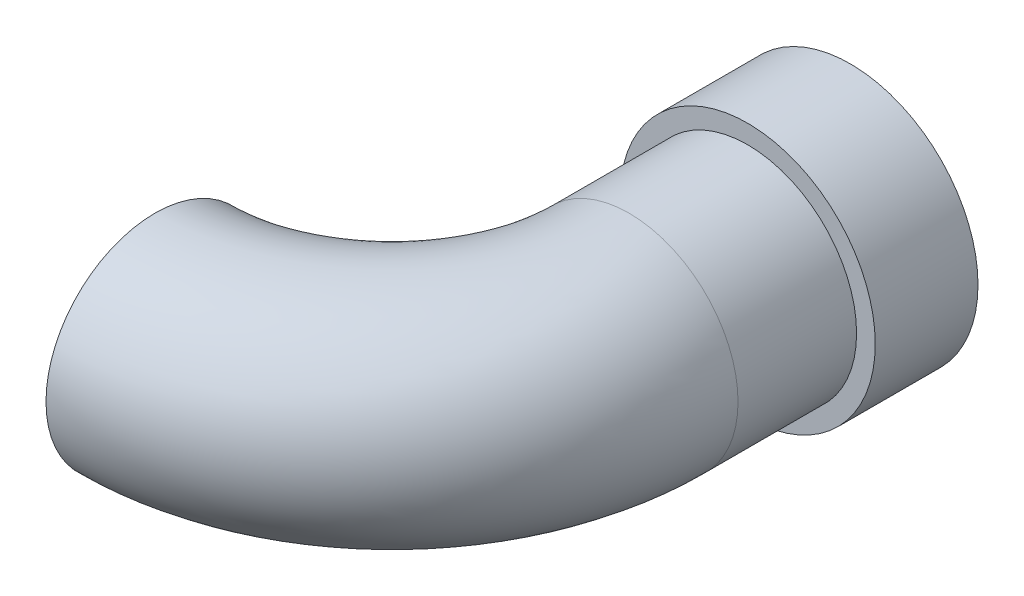
ISO-10303-21;
HEADER;
FILE_DESCRIPTION(('STEP AP214'),'2;1');
FILE_NAME('part.step','',(''),(''),'','','');
FILE_SCHEMA(('AUTOMOTIVE_DESIGN { 1 0 10303 214 1 1 1 1 }'));
ENDSEC;
DATA;
#1=APPLICATION_CONTEXT('core data for automotive mechanical design processes');
#2=APPLICATION_PROTOCOL_DEFINITION('international standard','automotive_design',2000,#1);
#3=PRODUCT_CONTEXT('',#1,'mechanical');
#4=PRODUCT('Part','Part','',(#3));
#5=PRODUCT_RELATED_PRODUCT_CATEGORY('part','',(#4));
#6=PRODUCT_DEFINITION_FORMATION('','',#4);
#7=PRODUCT_DEFINITION_CONTEXT('part definition',#1,'design');
#8=PRODUCT_DEFINITION('design','',#6,#7);
#9=PRODUCT_DEFINITION_SHAPE('','',#8);
#10=(LENGTH_UNIT() NAMED_UNIT(*) SI_UNIT(.MILLI.,.METRE.));
#11=(NAMED_UNIT(*) PLANE_ANGLE_UNIT() SI_UNIT($,.RADIAN.));
#12=(NAMED_UNIT(*) SI_UNIT($,.STERADIAN.) SOLID_ANGLE_UNIT());
#13=UNCERTAINTY_MEASURE_WITH_UNIT(LENGTH_MEASURE(1.E-05),#10,'distance_accuracy_value','');
#14=(GEOMETRIC_REPRESENTATION_CONTEXT(3) GLOBAL_UNCERTAINTY_ASSIGNED_CONTEXT((#13)) GLOBAL_UNIT_ASSIGNED_CONTEXT((#10,
#11,#12)) REPRESENTATION_CONTEXT('',''));
#15=CARTESIAN_POINT('',(0.,0.,0.));
#16=DIRECTION('',(0.,0.,1.));
#17=DIRECTION('',(1.,0.,0.));
#18=AXIS2_PLACEMENT_3D('',#15,#16,#17);
#19=CARTESIAN_POINT('',(0.,0.,16.51));
#20=DIRECTION('',(0.,0.,-1.));
#21=DIRECTION('',(-1.,0.,0.));
#22=AXIS2_PLACEMENT_3D('',#19,#20,#21);
#23=CYLINDRICAL_SURFACE('',#22,17.5);
#24=CARTESIAN_POINT('',(0.,0.,0.));
#25=DIRECTION('',(0.,0.,1.));
#26=DIRECTION('',(1.,0.,0.));
#27=AXIS2_PLACEMENT_3D('',#24,#25,#26);
#28=CIRCLE('',#27,17.5);
#29=CARTESIAN_POINT('',(17.5,0.,0.));
#30=VERTEX_POINT('',#29);
#31=EDGE_CURVE('E47',#30,#30,#28,.T.);
#32=ORIENTED_EDGE('',*,*,#31,.F.);
#33=EDGE_LOOP('',(#32));
#34=FACE_BOUND('',#33,.T.);
#35=CARTESIAN_POINT('',(0.,0.,10.16));
#36=DIRECTION('',(0.,0.,1.));
#37=DIRECTION('',(1.,0.,0.));
#38=AXIS2_PLACEMENT_3D('',#35,#36,#37);
#39=CIRCLE('',#38,17.5);
#40=CARTESIAN_POINT('',(17.5,0.,10.16));
#41=VERTEX_POINT('',#40);
#42=EDGE_CURVE('E59',#41,#41,#39,.T.);
#43=ORIENTED_EDGE('',*,*,#42,.T.);
#44=EDGE_LOOP('',(#43));
#45=FACE_BOUND('',#44,.T.);
#46=ADVANCED_FACE('F34',(#34,#45),#23,.F.);
#47=CARTESIAN_POINT('',(0.,0.,16.51));
#48=DIRECTION('',(0.,0.,1.));
#49=DIRECTION('',(1.,0.,0.));
#50=AXIS2_PLACEMENT_3D('',#47,#48,#49);
#51=PLANE('',#50);
#52=CARTESIAN_POINT('',(0.,0.,16.51));
#53=DIRECTION('',(0.,0.,1.));
#54=DIRECTION('',(1.,0.,0.));
#55=AXIS2_PLACEMENT_3D('',#52,#53,#54);
#56=CIRCLE('',#55,20.5);
#57=CARTESIAN_POINT('',(20.5,0.,16.51));
#58=VERTEX_POINT('',#57);
#59=EDGE_CURVE('E10',#58,#58,#56,.T.);
#60=ORIENTED_EDGE('',*,*,#59,.T.);
#61=EDGE_LOOP('',(#60));
#62=FACE_BOUND('',#61,.T.);
#63=CARTESIAN_POINT('',(0.,0.,16.51));
#64=DIRECTION('',(0.,0.,1.));
#65=DIRECTION('',(1.,0.,0.));
#66=AXIS2_PLACEMENT_3D('',#63,#64,#65);
#67=CIRCLE('',#66,17.5);
#68=CARTESIAN_POINT('',(17.5,0.,16.51));
#69=VERTEX_POINT('',#68);
#70=EDGE_CURVE('E45',#69,#69,#67,.T.);
#71=ORIENTED_EDGE('',*,*,#70,.F.);
#72=EDGE_LOOP('',(#71));
#73=FACE_BOUND('',#72,.T.);
#74=ADVANCED_FACE('F99',(#62,#73),#51,.T.);
#75=CARTESIAN_POINT('',(0.,0.,0.));
#76=DIRECTION('',(0.,0.,1.));
#77=DIRECTION('',(1.,0.,0.));
#78=AXIS2_PLACEMENT_3D('',#75,#76,#77);
#79=PLANE('',#78);
#80=CARTESIAN_POINT('',(0.,0.,0.));
#81=DIRECTION('',(0.,0.,1.));
#82=DIRECTION('',(1.,0.,0.));
#83=AXIS2_PLACEMENT_3D('',#80,#81,#82);
#84=CIRCLE('',#83,20.5);
#85=CARTESIAN_POINT('',(20.5,0.,0.));
#86=VERTEX_POINT('',#85);
#87=EDGE_CURVE('E38',#86,#86,#84,.T.);
#88=ORIENTED_EDGE('',*,*,#87,.F.);
#89=EDGE_LOOP('',(#88));
#90=FACE_BOUND('',#89,.T.);
#91=ORIENTED_EDGE('',*,*,#31,.T.);
#92=EDGE_LOOP('',(#91));
#93=FACE_BOUND('',#92,.T.);
#94=ADVANCED_FACE('F95',(#90,#93),#79,.F.);
#95=CARTESIAN_POINT('',(0.,0.,16.51));
#96=DIRECTION('',(0.,0.,-1.));
#97=DIRECTION('',(-1.,0.,0.));
#98=AXIS2_PLACEMENT_3D('',#95,#96,#97);
#99=CYLINDRICAL_SURFACE('',#98,20.5);
#100=ORIENTED_EDGE('',*,*,#59,.F.);
#101=EDGE_LOOP('',(#100));
#102=FACE_BOUND('',#101,.T.);
#103=ORIENTED_EDGE('',*,*,#87,.T.);
#104=EDGE_LOOP('',(#103));
#105=FACE_BOUND('',#104,.T.);
#106=ADVANCED_FACE('F36',(#102,#105),#99,.T.);
#107=CARTESIAN_POINT('',(-38.1,0.,35.56));
#108=DIRECTION('',(0.,-1.,0.));
#109=DIRECTION('',(0.,0.,-1.));
#110=AXIS2_PLACEMENT_3D('',#107,#108,#109);
#111=TOROIDAL_SURFACE('',#110,38.1,17.5);
#112=CARTESIAN_POINT('',(0.,0.,35.56));
#113=DIRECTION('',(0.,0.,1.));
#114=DIRECTION('',(1.,0.,0.));
#115=AXIS2_PLACEMENT_3D('',#112,#113,#114);
#116=CIRCLE('',#115,17.5);
#117=CARTESIAN_POINT('',(17.5,0.,35.56));
#118=VERTEX_POINT('',#117);
#119=EDGE_CURVE('E58',#118,#118,#116,.T.);
#120=CARTESIAN_POINT('',(-38.1,0.,73.66));
#121=DIRECTION('',(-1.,0.,0.));
#122=DIRECTION('',(0.,0.,1.));
#123=AXIS2_PLACEMENT_3D('',#120,#121,#122);
#124=CIRCLE('',#123,17.5);
#125=CARTESIAN_POINT('',(-38.1,0.,91.16));
#126=VERTEX_POINT('',#125);
#127=EDGE_CURVE('E50',#126,#126,#124,.T.);
#128=CARTESIAN_POINT('',(-38.1,0.,35.56));
#129=DIRECTION('',(0.,-1.,0.));
#130=DIRECTION('',(0.,0.,-1.));
#131=AXIS2_PLACEMENT_3D('',#128,#129,#130);
#132=CIRCLE('',#131,55.6);
#133=EDGE_CURVE('',#118,#126,#132,.T.);
#134=ORIENTED_EDGE('',*,*,#119,.T.);
#135=ORIENTED_EDGE('',*,*,#127,.F.);
#136=ORIENTED_EDGE('',*,*,#133,.T.);
#137=ORIENTED_EDGE('',*,*,#133,.F.);
#138=EDGE_LOOP('',(#134,#136,#135,#137));
#139=FACE_BOUND('',#138,.T.);
#140=ADVANCED_FACE('F77',(#139),#111,.T.);
#141=CARTESIAN_POINT('',(-38.1,0.,35.56));
#142=DIRECTION('',(0.,-1.,0.));
#143=DIRECTION('',(0.,0.,-1.));
#144=AXIS2_PLACEMENT_3D('',#141,#142,#143);
#145=TOROIDAL_SURFACE('',#144,38.1,15.5);
#146=CARTESIAN_POINT('',(0.,0.,35.56));
#147=DIRECTION('',(0.,0.,1.));
#148=DIRECTION('',(1.,0.,0.));
#149=AXIS2_PLACEMENT_3D('',#146,#147,#148);
#150=CIRCLE('',#149,15.5);
#151=CARTESIAN_POINT('',(15.5,0.,35.56));
#152=VERTEX_POINT('',#151);
#153=EDGE_CURVE('E62',#152,#152,#150,.T.);
#154=CARTESIAN_POINT('',(-38.1,0.,73.66));
#155=DIRECTION('',(-1.,0.,0.));
#156=DIRECTION('',(0.,0.,1.));
#157=AXIS2_PLACEMENT_3D('',#154,#155,#156);
#158=CIRCLE('',#157,15.5);
#159=CARTESIAN_POINT('',(-38.1,0.,89.16));
#160=VERTEX_POINT('',#159);
#161=EDGE_CURVE('E55',#160,#160,#158,.T.);
#162=CARTESIAN_POINT('',(-38.1,0.,35.56));
#163=DIRECTION('',(0.,-1.,0.));
#164=DIRECTION('',(0.,0.,-1.));
#165=AXIS2_PLACEMENT_3D('',#162,#163,#164);
#166=CIRCLE('',#165,53.6);
#167=EDGE_CURVE('',#152,#160,#166,.T.);
#168=ORIENTED_EDGE('',*,*,#153,.F.);
#169=ORIENTED_EDGE('',*,*,#161,.T.);
#170=ORIENTED_EDGE('',*,*,#167,.T.);
#171=ORIENTED_EDGE('',*,*,#167,.F.);
#172=EDGE_LOOP('',(#168,#170,#169,#171));
#173=FACE_BOUND('',#172,.T.);
#174=ADVANCED_FACE('F74',(#173),#145,.F.);
#175=CARTESIAN_POINT('',(0.,0.,35.56));
#176=DIRECTION('',(0.,0.,-1.));
#177=DIRECTION('',(-1.,0.,0.));
#178=AXIS2_PLACEMENT_3D('',#175,#176,#177);
#179=CYLINDRICAL_SURFACE('',#178,15.5);
#180=ORIENTED_EDGE('',*,*,#153,.T.);
#181=EDGE_LOOP('',(#180));
#182=FACE_BOUND('',#181,.T.);
#183=CARTESIAN_POINT('',(0.,0.,10.16));
#184=DIRECTION('',(0.,0.,1.));
#185=DIRECTION('',(1.,0.,0.));
#186=AXIS2_PLACEMENT_3D('',#183,#184,#185);
#187=CIRCLE('',#186,15.5);
#188=CARTESIAN_POINT('',(15.5,0.,10.16));
#189=VERTEX_POINT('',#188);
#190=EDGE_CURVE('E63',#189,#189,#187,.T.);
#191=ORIENTED_EDGE('',*,*,#190,.F.);
#192=EDGE_LOOP('',(#191));
#193=FACE_BOUND('',#192,.T.);
#194=ADVANCED_FACE('F71',(#182,#193),#179,.F.);
#195=CARTESIAN_POINT('',(0.,0.,35.56));
#196=DIRECTION('',(0.,0.,-1.));
#197=DIRECTION('',(-1.,0.,0.));
#198=AXIS2_PLACEMENT_3D('',#195,#196,#197);
#199=CYLINDRICAL_SURFACE('',#198,17.5);
#200=ORIENTED_EDGE('',*,*,#70,.T.);
#201=EDGE_LOOP('',(#200));
#202=FACE_BOUND('',#201,.T.);
#203=ORIENTED_EDGE('',*,*,#119,.F.);
#204=EDGE_LOOP('',(#203));
#205=FACE_BOUND('',#204,.T.);
#206=ADVANCED_FACE('F85',(#202,#205),#199,.T.);
#207=CARTESIAN_POINT('',(-38.1,0.,73.66));
#208=DIRECTION('',(-1.,0.,0.));
#209=DIRECTION('',(0.,0.,1.));
#210=AXIS2_PLACEMENT_3D('',#207,#208,#209);
#211=PLANE('',#210);
#212=ORIENTED_EDGE('',*,*,#161,.F.);
#213=EDGE_LOOP('',(#212));
#214=FACE_BOUND('',#213,.T.);
#215=ORIENTED_EDGE('',*,*,#127,.T.);
#216=EDGE_LOOP('',(#215));
#217=FACE_BOUND('',#216,.T.);
#218=ADVANCED_FACE('F81',(#214,#217),#211,.T.);
#219=CARTESIAN_POINT('',(0.,0.,10.16));
#220=DIRECTION('',(0.,0.,1.));
#221=DIRECTION('',(1.,0.,0.));
#222=AXIS2_PLACEMENT_3D('',#219,#220,#221);
#223=PLANE('',#222);
#224=ORIENTED_EDGE('',*,*,#190,.T.);
#225=EDGE_LOOP('',(#224));
#226=FACE_BOUND('',#225,.T.);
#227=ORIENTED_EDGE('',*,*,#42,.F.);
#228=EDGE_LOOP('',(#227));
#229=FACE_BOUND('',#228,.T.);
#230=ADVANCED_FACE('F84',(#226,#229),#223,.F.);
#231=CLOSED_SHELL('',(#46,#74,#94,#106,#140,#174,#194,#206,#218,#230));
#232=MANIFOLD_SOLID_BREP('B2',#231);
#233=ADVANCED_BREP_SHAPE_REPRESENTATION('',(#18,#232),#14);
#234=SHAPE_DEFINITION_REPRESENTATION(#9,#233);
ENDSEC;
END-ISO-10303-21;
